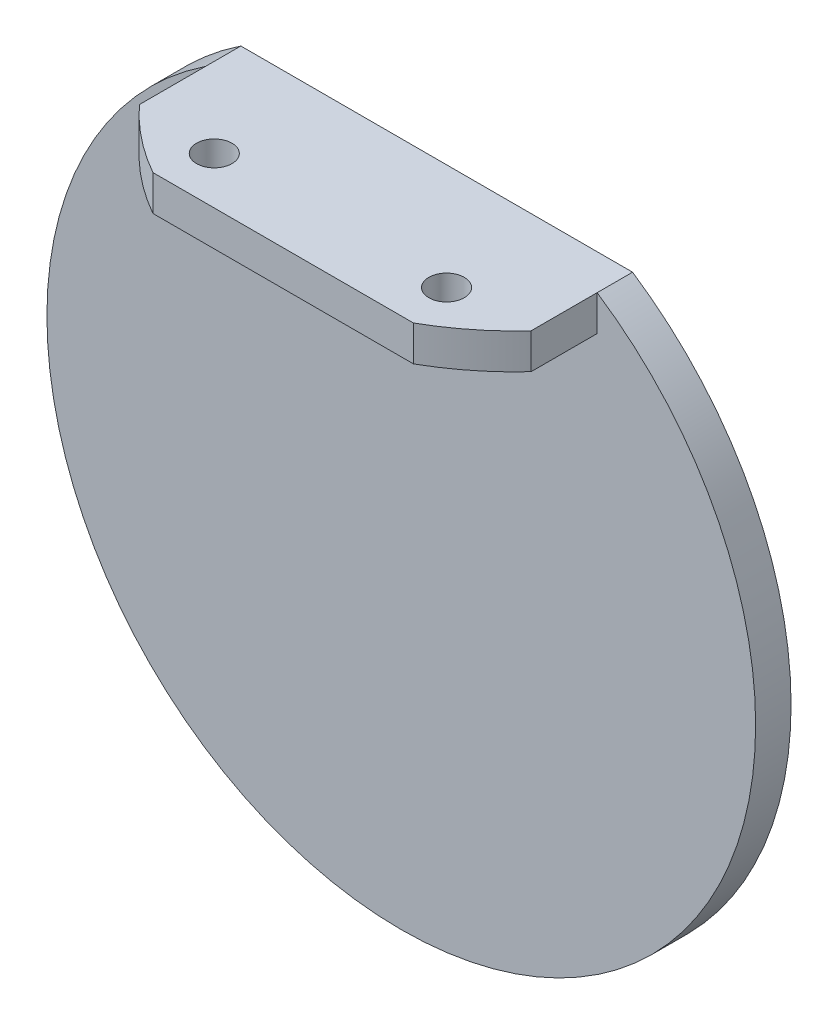
ISO-10303-21;
HEADER;
FILE_DESCRIPTION(('STEP AP214'),'2;1');
FILE_NAME('part.step','',(''),(''),'','','');
FILE_SCHEMA(('AUTOMOTIVE_DESIGN { 1 0 10303 214 1 1 1 1 }'));
ENDSEC;
DATA;
#1=APPLICATION_CONTEXT('core data for automotive mechanical design processes');
#2=APPLICATION_PROTOCOL_DEFINITION('international standard','automotive_design',2000,#1);
#3=PRODUCT_CONTEXT('',#1,'mechanical');
#4=PRODUCT('Part','Part','',(#3));
#5=PRODUCT_RELATED_PRODUCT_CATEGORY('part','',(#4));
#6=PRODUCT_DEFINITION_FORMATION('','',#4);
#7=PRODUCT_DEFINITION_CONTEXT('part definition',#1,'design');
#8=PRODUCT_DEFINITION('design','',#6,#7);
#9=PRODUCT_DEFINITION_SHAPE('','',#8);
#10=(LENGTH_UNIT() NAMED_UNIT(*) SI_UNIT(.MILLI.,.METRE.));
#11=(NAMED_UNIT(*) PLANE_ANGLE_UNIT() SI_UNIT($,.RADIAN.));
#12=(NAMED_UNIT(*) SI_UNIT($,.STERADIAN.) SOLID_ANGLE_UNIT());
#13=UNCERTAINTY_MEASURE_WITH_UNIT(LENGTH_MEASURE(1.E-05),#10,'distance_accuracy_value','');
#14=(GEOMETRIC_REPRESENTATION_CONTEXT(3) GLOBAL_UNCERTAINTY_ASSIGNED_CONTEXT((#13)) GLOBAL_UNIT_ASSIGNED_CONTEXT((#10,
#11,#12)) REPRESENTATION_CONTEXT('',''));
#15=CARTESIAN_POINT('',(0.,0.,0.));
#16=DIRECTION('',(0.,0.,1.));
#17=DIRECTION('',(1.,0.,0.));
#18=AXIS2_PLACEMENT_3D('',#15,#16,#17);
#19=CARTESIAN_POINT('',(0.,25.,3.));
#20=DIRECTION('',(0.,1.,0.));
#21=DIRECTION('',(0.,0.,1.));
#22=AXIS2_PLACEMENT_3D('',#19,#20,#21);
#23=PLANE('',#22);
#24=CARTESIAN_POINT('',(-9.833123951777,25.,9.));
#25=DIRECTION('',(0.,-1.,0.));
#26=DIRECTION('',(0.,0.,-1.));
#27=AXIS2_PLACEMENT_3D('',#24,#25,#26);
#28=CIRCLE('',#27,1.5);
#29=CARTESIAN_POINT('',(-9.833123951777,25.,7.5));
#30=VERTEX_POINT('',#29);
#31=EDGE_CURVE('E208',#30,#30,#28,.T.);
#32=ORIENTED_EDGE('',*,*,#31,.T.);
#33=EDGE_LOOP('',(#32));
#34=FACE_BOUND('',#33,.T.);
#35=CARTESIAN_POINT('',(9.833123951777,25.,9.));
#36=DIRECTION('',(0.,-1.,0.));
#37=DIRECTION('',(0.,0.,1.));
#38=AXIS2_PLACEMENT_3D('',#35,#36,#37);
#39=CIRCLE('',#38,1.5);
#40=CARTESIAN_POINT('',(9.833123951777,25.,10.5));
#41=VERTEX_POINT('',#40);
#42=EDGE_CURVE('E211',#41,#41,#39,.T.);
#43=ORIENTED_EDGE('',*,*,#42,.T.);
#44=EDGE_LOOP('',(#43));
#45=FACE_BOUND('',#44,.T.);
#46=CARTESIAN_POINT('',(0.00187604822569042,25.,-6.61500000000007));
#47=DIRECTION('',(0.,-1.,0.));
#48=DIRECTION('',(0.,0.,1.));
#49=AXIS2_PLACEMENT_3D('',#46,#47,#48);
#50=CIRCLE('',#49,22.5);
#51=CARTESIAN_POINT('',(-11.0209083096395,25.,13.));
#52=VERTEX_POINT('',#51);
#53=CARTESIAN_POINT('',(-16.583123951777,25.,8.58986024269573));
#54=VERTEX_POINT('',#53);
#55=EDGE_CURVE('E98',#52,#54,#50,.T.);
#56=ORIENTED_EDGE('',*,*,#55,.F.);
#57=DIRECTION('',(1.,0.,0.));
#58=VECTOR('',#57,1.);
#59=CARTESIAN_POINT('',(0.,25.,13.));
#60=LINE('',#59,#58);
#61=CARTESIAN_POINT('',(11.0246604060909,25.,13.));
#62=VERTEX_POINT('',#61);
#63=EDGE_CURVE('E132',#52,#62,#60,.T.);
#64=ORIENTED_EDGE('',*,*,#63,.T.);
#65=CARTESIAN_POINT('',(0.00187604822569042,25.,-6.61500000000007));
#66=DIRECTION('',(0.,-1.,0.));
#67=DIRECTION('',(0.,0.,1.));
#68=AXIS2_PLACEMENT_3D('',#65,#66,#67);
#69=CIRCLE('',#68,22.5);
#70=CARTESIAN_POINT('',(16.583123951777,25.,8.59395190211916));
#71=VERTEX_POINT('',#70);
#72=EDGE_CURVE('E57',#71,#62,#69,.T.);
#73=ORIENTED_EDGE('',*,*,#72,.F.);
#74=DIRECTION('',(0.,0.,-1.));
#75=VECTOR('',#74,1.);
#76=CARTESIAN_POINT('',(16.583123951777,25.,13.));
#77=LINE('',#76,#75);
#78=CARTESIAN_POINT('',(16.583123951777,25.,3.));
#79=VERTEX_POINT('',#78);
#80=EDGE_CURVE('E124',#71,#79,#77,.T.);
#81=ORIENTED_EDGE('',*,*,#80,.T.);
#82=DIRECTION('',(0.,0.,-1.));
#83=VECTOR('',#82,1.);
#84=CARTESIAN_POINT('',(16.583123951777,25.,3.));
#85=LINE('',#84,#83);
#86=CARTESIAN_POINT('',(16.583123951777,25.,0.));
#87=VERTEX_POINT('',#86);
#88=EDGE_CURVE('E140',#79,#87,#85,.T.);
#89=ORIENTED_EDGE('',*,*,#88,.T.);
#90=DIRECTION('',(1.,0.,0.));
#91=VECTOR('',#90,1.);
#92=CARTESIAN_POINT('',(0.,25.,0.));
#93=LINE('',#92,#91);
#94=CARTESIAN_POINT('',(-16.583123951777,25.,0.));
#95=VERTEX_POINT('',#94);
#96=EDGE_CURVE('E142',#95,#87,#93,.T.);
#97=ORIENTED_EDGE('',*,*,#96,.F.);
#98=DIRECTION('',(0.,0.,-1.));
#99=VECTOR('',#98,1.);
#100=CARTESIAN_POINT('',(-16.583123951777,25.,3.));
#101=LINE('',#100,#99);
#102=CARTESIAN_POINT('',(-16.583123951777,25.,3.));
#103=VERTEX_POINT('',#102);
#104=EDGE_CURVE('E121',#103,#95,#101,.T.);
#105=ORIENTED_EDGE('',*,*,#104,.F.);
#106=DIRECTION('',(0.,0.,-1.));
#107=VECTOR('',#106,1.);
#108=CARTESIAN_POINT('',(-16.583123951777,25.,13.));
#109=LINE('',#108,#107);
#110=EDGE_CURVE('E113',#54,#103,#109,.T.);
#111=ORIENTED_EDGE('',*,*,#110,.F.);
#112=EDGE_LOOP('',(#56,#64,#73,#81,#89,#97,#105,#111));
#113=FACE_BOUND('',#112,.T.);
#114=ADVANCED_FACE('F42',(#34,#45,#113),#23,.T.);
#115=CARTESIAN_POINT('',(0.,0.,3.));
#116=DIRECTION('',(0.,0.,-1.));
#117=DIRECTION('',(-1.,0.,0.));
#118=AXIS2_PLACEMENT_3D('',#115,#116,#117);
#119=CYLINDRICAL_SURFACE('',#118,30.);
#120=CARTESIAN_POINT('',(0.,0.,0.));
#121=DIRECTION('',(0.,0.,1.));
#122=DIRECTION('',(1.,0.,0.));
#123=AXIS2_PLACEMENT_3D('',#120,#121,#122);
#124=CIRCLE('',#123,30.);
#125=EDGE_CURVE('E141',#95,#87,#124,.T.);
#126=ORIENTED_EDGE('',*,*,#125,.T.);
#127=ORIENTED_EDGE('',*,*,#88,.F.);
#128=CARTESIAN_POINT('',(0.,0.,3.));
#129=DIRECTION('',(0.,0.,1.));
#130=DIRECTION('',(1.,0.,0.));
#131=AXIS2_PLACEMENT_3D('',#128,#129,#130);
#132=CIRCLE('',#131,30.);
#133=EDGE_CURVE('E136',#103,#79,#132,.T.);
#134=ORIENTED_EDGE('',*,*,#133,.F.);
#135=ORIENTED_EDGE('',*,*,#104,.T.);
#136=EDGE_LOOP('',(#126,#127,#134,#135));
#137=FACE_BOUND('',#136,.T.);
#138=ADVANCED_FACE('F188',(#137),#119,.T.);
#139=CARTESIAN_POINT('',(0.,0.,3.));
#140=DIRECTION('',(0.,0.,1.));
#141=DIRECTION('',(1.,0.,0.));
#142=AXIS2_PLACEMENT_3D('',#139,#140,#141);
#143=PLANE('',#142);
#144=DIRECTION('',(0.,-1.,0.));
#145=VECTOR('',#144,1.);
#146=CARTESIAN_POINT('',(-16.5831239517769,0.,3.));
#147=LINE('',#146,#145);
#148=CARTESIAN_POINT('',(-16.583123951777,22.,3.));
#149=VERTEX_POINT('',#148);
#150=EDGE_CURVE('E168',#103,#149,#147,.T.);
#151=ORIENTED_EDGE('',*,*,#150,.F.);
#152=ORIENTED_EDGE('',*,*,#133,.T.);
#153=DIRECTION('',(0.,-1.,0.));
#154=VECTOR('',#153,1.);
#155=CARTESIAN_POINT('',(16.583123951777,0.,3.));
#156=LINE('',#155,#154);
#157=CARTESIAN_POINT('',(16.583123951777,22.,3.));
#158=VERTEX_POINT('',#157);
#159=EDGE_CURVE('E163',#79,#158,#156,.T.);
#160=ORIENTED_EDGE('',*,*,#159,.T.);
#161=DIRECTION('',(-1.,0.,0.));
#162=VECTOR('',#161,1.);
#163=CARTESIAN_POINT('',(0.,22.,3.));
#164=LINE('',#163,#162);
#165=EDGE_CURVE('E159',#158,#149,#164,.T.);
#166=ORIENTED_EDGE('',*,*,#165,.T.);
#167=EDGE_LOOP('',(#151,#152,#160,#166));
#168=FACE_BOUND('',#167,.T.);
#169=ADVANCED_FACE('F185',(#168),#143,.T.);
#170=CARTESIAN_POINT('',(0.,0.,0.));
#171=DIRECTION('',(0.,0.,1.));
#172=DIRECTION('',(1.,0.,0.));
#173=AXIS2_PLACEMENT_3D('',#170,#171,#172);
#174=PLANE('',#173);
#175=ORIENTED_EDGE('',*,*,#96,.T.);
#176=ORIENTED_EDGE('',*,*,#125,.F.);
#177=EDGE_LOOP('',(#175,#176));
#178=FACE_BOUND('',#177,.T.);
#179=ADVANCED_FACE('F191',(#178),#174,.F.);
#180=CARTESIAN_POINT('',(-16.5831239517769,0.,13.));
#181=DIRECTION('',(1.,0.,0.));
#182=DIRECTION('',(0.,1.,0.));
#183=AXIS2_PLACEMENT_3D('',#180,#181,#182);
#184=PLANE('',#183);
#185=DIRECTION('',(0.,0.,-1.));
#186=VECTOR('',#185,1.);
#187=CARTESIAN_POINT('',(-16.583123951777,22.,13.));
#188=LINE('',#187,#186);
#189=CARTESIAN_POINT('',(-16.583123951777,22.,8.58986024269573));
#190=VERTEX_POINT('',#189);
#191=EDGE_CURVE('E115',#190,#149,#188,.T.);
#192=ORIENTED_EDGE('',*,*,#191,.F.);
#193=DIRECTION('',(0.,1.,0.));
#194=VECTOR('',#193,1.);
#195=CARTESIAN_POINT('',(-16.583123951777,-30.,8.58986024269573));
#196=LINE('',#195,#194);
#197=EDGE_CURVE('E101',#190,#54,#196,.T.);
#198=ORIENTED_EDGE('',*,*,#197,.T.);
#199=ORIENTED_EDGE('',*,*,#110,.T.);
#200=ORIENTED_EDGE('',*,*,#150,.T.);
#201=EDGE_LOOP('',(#192,#198,#199,#200));
#202=FACE_BOUND('',#201,.T.);
#203=ADVANCED_FACE('F111',(#202),#184,.F.);
#204=CARTESIAN_POINT('',(0.,22.,13.));
#205=DIRECTION('',(0.,-1.,0.));
#206=DIRECTION('',(0.,0.,-1.));
#207=AXIS2_PLACEMENT_3D('',#204,#205,#206);
#208=PLANE('',#207);
#209=CARTESIAN_POINT('',(-9.833123951777,22.,9.));
#210=DIRECTION('',(0.,-1.,0.));
#211=DIRECTION('',(0.,0.,-1.));
#212=AXIS2_PLACEMENT_3D('',#209,#210,#211);
#213=CIRCLE('',#212,1.5);
#214=CARTESIAN_POINT('',(-9.833123951777,22.,7.5));
#215=VERTEX_POINT('',#214);
#216=EDGE_CURVE('E214',#215,#215,#213,.T.);
#217=ORIENTED_EDGE('',*,*,#216,.F.);
#218=EDGE_LOOP('',(#217));
#219=FACE_BOUND('',#218,.T.);
#220=CARTESIAN_POINT('',(9.833123951777,22.,9.));
#221=DIRECTION('',(0.,-1.,0.));
#222=DIRECTION('',(0.,0.,1.));
#223=AXIS2_PLACEMENT_3D('',#220,#221,#222);
#224=CIRCLE('',#223,1.5);
#225=CARTESIAN_POINT('',(9.833123951777,22.,10.5));
#226=VERTEX_POINT('',#225);
#227=EDGE_CURVE('E215',#226,#226,#224,.T.);
#228=ORIENTED_EDGE('',*,*,#227,.F.);
#229=EDGE_LOOP('',(#228));
#230=FACE_BOUND('',#229,.T.);
#231=CARTESIAN_POINT('',(0.00187604822569042,22.,-6.61500000000007));
#232=DIRECTION('',(0.,-1.,0.));
#233=DIRECTION('',(0.,0.,-1.));
#234=AXIS2_PLACEMENT_3D('',#231,#232,#233);
#235=CIRCLE('',#234,22.5);
#236=CARTESIAN_POINT('',(-11.0209083096395,22.,13.));
#237=VERTEX_POINT('',#236);
#238=EDGE_CURVE('E65',#190,#237,#235,.F.);
#239=ORIENTED_EDGE('',*,*,#238,.F.);
#240=ORIENTED_EDGE('',*,*,#191,.T.);
#241=ORIENTED_EDGE('',*,*,#165,.F.);
#242=DIRECTION('',(0.,0.,-1.));
#243=VECTOR('',#242,1.);
#244=CARTESIAN_POINT('',(16.583123951777,22.,13.));
#245=LINE('',#244,#243);
#246=CARTESIAN_POINT('',(16.583123951777,22.,8.59395190211916));
#247=VERTEX_POINT('',#246);
#248=EDGE_CURVE('E129',#247,#158,#245,.T.);
#249=ORIENTED_EDGE('',*,*,#248,.F.);
#250=CARTESIAN_POINT('',(0.00187604822569042,22.,-6.61500000000007));
#251=DIRECTION('',(0.,-1.,0.));
#252=DIRECTION('',(0.,0.,-1.));
#253=AXIS2_PLACEMENT_3D('',#250,#251,#252);
#254=CIRCLE('',#253,22.5);
#255=CARTESIAN_POINT('',(11.0246604060909,22.,13.));
#256=VERTEX_POINT('',#255);
#257=EDGE_CURVE('E117',#256,#247,#254,.F.);
#258=ORIENTED_EDGE('',*,*,#257,.F.);
#259=DIRECTION('',(-1.,0.,0.));
#260=VECTOR('',#259,1.);
#261=CARTESIAN_POINT('',(0.,22.,13.));
#262=LINE('',#261,#260);
#263=EDGE_CURVE('E125',#256,#237,#262,.T.);
#264=ORIENTED_EDGE('',*,*,#263,.T.);
#265=EDGE_LOOP('',(#239,#240,#241,#249,#258,#264));
#266=FACE_BOUND('',#265,.T.);
#267=ADVANCED_FACE('F183',(#219,#230,#266),#208,.T.);
#268=CARTESIAN_POINT('',(16.583123951777,0.,13.));
#269=DIRECTION('',(1.,0.,0.));
#270=DIRECTION('',(0.,0.,-1.));
#271=AXIS2_PLACEMENT_3D('',#268,#269,#270);
#272=PLANE('',#271);
#273=DIRECTION('',(0.,1.,0.));
#274=VECTOR('',#273,1.);
#275=CARTESIAN_POINT('',(16.583123951777,-30.,8.59395190211916));
#276=LINE('',#275,#274);
#277=EDGE_CURVE('E107',#247,#71,#276,.T.);
#278=ORIENTED_EDGE('',*,*,#277,.F.);
#279=ORIENTED_EDGE('',*,*,#248,.T.);
#280=ORIENTED_EDGE('',*,*,#159,.F.);
#281=ORIENTED_EDGE('',*,*,#80,.F.);
#282=EDGE_LOOP('',(#278,#279,#280,#281));
#283=FACE_BOUND('',#282,.T.);
#284=ADVANCED_FACE('F181',(#283),#272,.T.);
#285=CARTESIAN_POINT('',(0.,0.,13.));
#286=DIRECTION('',(0.,0.,-1.));
#287=DIRECTION('',(-1.,0.,0.));
#288=AXIS2_PLACEMENT_3D('',#285,#286,#287);
#289=PLANE('',#288);
#290=ORIENTED_EDGE('',*,*,#63,.F.);
#291=DIRECTION('',(0.,1.,0.));
#292=VECTOR('',#291,1.);
#293=CARTESIAN_POINT('',(-11.0209083096395,-30.,13.));
#294=LINE('',#293,#292);
#295=EDGE_CURVE('E11',#52,#237,#294,.F.);
#296=ORIENTED_EDGE('',*,*,#295,.T.);
#297=ORIENTED_EDGE('',*,*,#263,.F.);
#298=DIRECTION('',(0.,1.,0.));
#299=VECTOR('',#298,1.);
#300=CARTESIAN_POINT('',(11.0246604060909,-30.,13.));
#301=LINE('',#300,#299);
#302=EDGE_CURVE('E50',#256,#62,#301,.T.);
#303=ORIENTED_EDGE('',*,*,#302,.T.);
#304=EDGE_LOOP('',(#290,#296,#297,#303));
#305=FACE_BOUND('',#304,.T.);
#306=ADVANCED_FACE('F155',(#305),#289,.F.);
#307=CARTESIAN_POINT('',(0.00187604822569042,-30.,-6.61500000000007));
#308=DIRECTION('',(0.,1.,0.));
#309=DIRECTION('',(0.,0.,1.));
#310=AXIS2_PLACEMENT_3D('',#307,#308,#309);
#311=CYLINDRICAL_SURFACE('',#310,22.5);
#312=ORIENTED_EDGE('',*,*,#257,.T.);
#313=ORIENTED_EDGE('',*,*,#277,.T.);
#314=ORIENTED_EDGE('',*,*,#72,.T.);
#315=ORIENTED_EDGE('',*,*,#302,.F.);
#316=EDGE_LOOP('',(#312,#313,#314,#315));
#317=FACE_BOUND('',#316,.T.);
#318=ADVANCED_FACE('F230',(#317),#311,.T.);
#319=CARTESIAN_POINT('',(0.00187604822569042,-30.,-6.61500000000007));
#320=DIRECTION('',(0.,1.,0.));
#321=DIRECTION('',(0.,0.,1.));
#322=AXIS2_PLACEMENT_3D('',#319,#320,#321);
#323=CYLINDRICAL_SURFACE('',#322,22.5);
#324=ORIENTED_EDGE('',*,*,#238,.T.);
#325=ORIENTED_EDGE('',*,*,#295,.F.);
#326=ORIENTED_EDGE('',*,*,#55,.T.);
#327=ORIENTED_EDGE('',*,*,#197,.F.);
#328=EDGE_LOOP('',(#324,#325,#326,#327));
#329=FACE_BOUND('',#328,.T.);
#330=ADVANCED_FACE('F100',(#329),#323,.T.);
#331=CARTESIAN_POINT('',(9.833123951777,25.,9.));
#332=DIRECTION('',(0.,-1.,0.));
#333=DIRECTION('',(0.,0.,-1.));
#334=AXIS2_PLACEMENT_3D('',#331,#332,#333);
#335=CYLINDRICAL_SURFACE('',#334,1.5);
#336=ORIENTED_EDGE('',*,*,#42,.F.);
#337=EDGE_LOOP('',(#336));
#338=FACE_BOUND('',#337,.T.);
#339=ORIENTED_EDGE('',*,*,#227,.T.);
#340=EDGE_LOOP('',(#339));
#341=FACE_BOUND('',#340,.T.);
#342=ADVANCED_FACE('F237',(#338,#341),#335,.F.);
#343=CARTESIAN_POINT('',(-9.833123951777,25.,9.));
#344=DIRECTION('',(0.,-1.,0.));
#345=DIRECTION('',(0.,0.,-1.));
#346=AXIS2_PLACEMENT_3D('',#343,#344,#345);
#347=CYLINDRICAL_SURFACE('',#346,1.5);
#348=ORIENTED_EDGE('',*,*,#31,.F.);
#349=EDGE_LOOP('',(#348));
#350=FACE_BOUND('',#349,.T.);
#351=ORIENTED_EDGE('',*,*,#216,.T.);
#352=EDGE_LOOP('',(#351));
#353=FACE_BOUND('',#352,.T.);
#354=ADVANCED_FACE('F284',(#350,#353),#347,.F.);
#355=CLOSED_SHELL('',(#114,#138,#169,#179,#203,#267,#284,#306,#318,#330,#342,#354));
#356=MANIFOLD_SOLID_BREP('B2',#355);
#357=ADVANCED_BREP_SHAPE_REPRESENTATION('',(#18,#356),#14);
#358=SHAPE_DEFINITION_REPRESENTATION(#9,#357);
ENDSEC;
END-ISO-10303-21;
